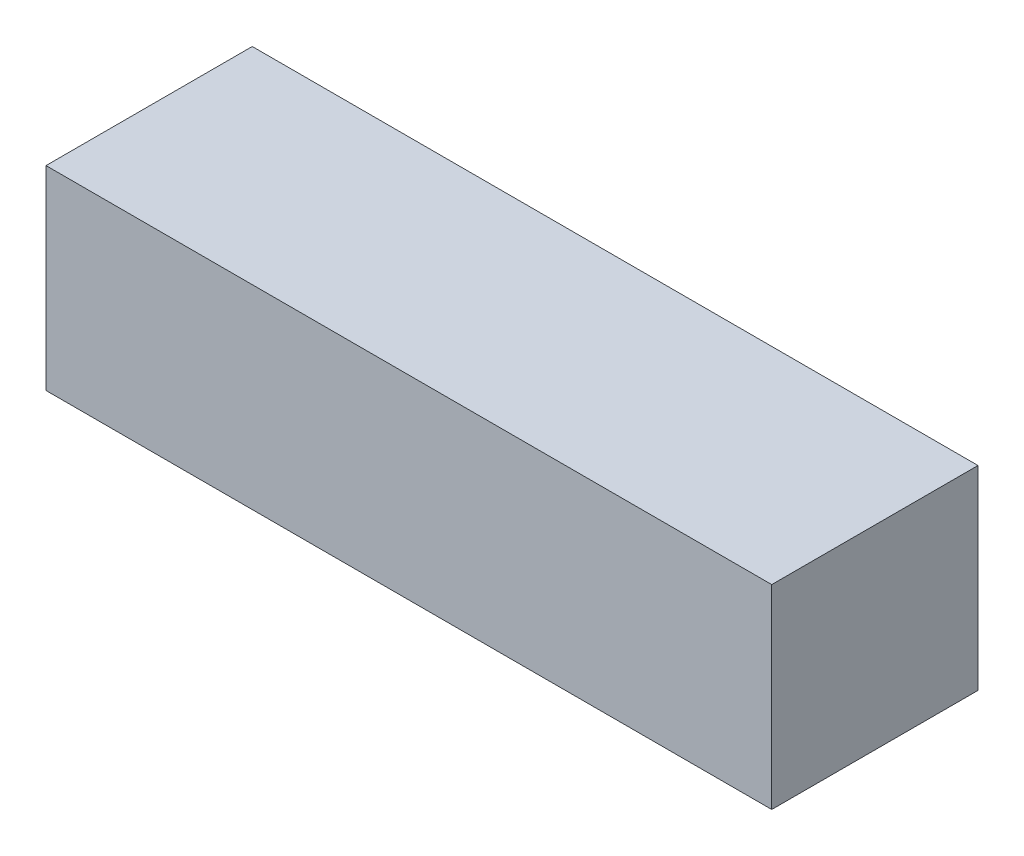
ISO-10303-21;
HEADER;
FILE_DESCRIPTION(('STEP AP214'),'2;1');
FILE_NAME('part.step','',(''),(''),'','','');
FILE_SCHEMA(('AUTOMOTIVE_DESIGN { 1 0 10303 214 1 1 1 1 }'));
ENDSEC;
DATA;
#1=APPLICATION_CONTEXT('core data for automotive mechanical design processes');
#2=APPLICATION_PROTOCOL_DEFINITION('international standard','automotive_design',2000,#1);
#3=PRODUCT_CONTEXT('',#1,'mechanical');
#4=PRODUCT('Part','Part','',(#3));
#5=PRODUCT_RELATED_PRODUCT_CATEGORY('part','',(#4));
#6=PRODUCT_DEFINITION_FORMATION('','',#4);
#7=PRODUCT_DEFINITION_CONTEXT('part definition',#1,'design');
#8=PRODUCT_DEFINITION('design','',#6,#7);
#9=PRODUCT_DEFINITION_SHAPE('','',#8);
#10=(LENGTH_UNIT() NAMED_UNIT(*) SI_UNIT(.MILLI.,.METRE.));
#11=(NAMED_UNIT(*) PLANE_ANGLE_UNIT() SI_UNIT($,.RADIAN.));
#12=(NAMED_UNIT(*) SI_UNIT($,.STERADIAN.) SOLID_ANGLE_UNIT());
#13=UNCERTAINTY_MEASURE_WITH_UNIT(LENGTH_MEASURE(1.E-05),#10,'distance_accuracy_value','');
#14=(GEOMETRIC_REPRESENTATION_CONTEXT(3) GLOBAL_UNCERTAINTY_ASSIGNED_CONTEXT((#13)) GLOBAL_UNIT_ASSIGNED_CONTEXT((#10,
#11,#12)) REPRESENTATION_CONTEXT('',''));
#15=CARTESIAN_POINT('',(0.,0.,0.));
#16=DIRECTION('',(0.,0.,1.));
#17=DIRECTION('',(1.,0.,0.));
#18=AXIS2_PLACEMENT_3D('',#15,#16,#17);
#19=CARTESIAN_POINT('',(9.5,5.1,2.7));
#20=DIRECTION('',(-1.,0.,0.));
#21=DIRECTION('',(0.,0.,1.));
#22=AXIS2_PLACEMENT_3D('',#19,#20,#21);
#23=PLANE('',#22);
#24=DIRECTION('',(0.,0.,-1.));
#25=VECTOR('',#24,1.);
#26=CARTESIAN_POINT('',(9.5,0.,2.7));
#27=LINE('',#26,#25);
#28=CARTESIAN_POINT('',(9.5,0.,2.7));
#29=VERTEX_POINT('',#28);
#30=CARTESIAN_POINT('',(9.5,0.,-2.7));
#31=VERTEX_POINT('',#30);
#32=EDGE_CURVE('E97',#29,#31,#27,.T.);
#33=ORIENTED_EDGE('',*,*,#32,.T.);
#34=DIRECTION('',(0.,-1.,0.));
#35=VECTOR('',#34,1.);
#36=CARTESIAN_POINT('',(9.5,5.1,-2.7));
#37=LINE('',#36,#35);
#38=CARTESIAN_POINT('',(9.5,5.1,-2.7));
#39=VERTEX_POINT('',#38);
#40=EDGE_CURVE('E11',#39,#31,#37,.T.);
#41=ORIENTED_EDGE('',*,*,#40,.F.);
#42=DIRECTION('',(0.,0.,-1.));
#43=VECTOR('',#42,1.);
#44=CARTESIAN_POINT('',(9.5,5.1,2.7));
#45=LINE('',#44,#43);
#46=CARTESIAN_POINT('',(9.5,5.1,2.7));
#47=VERTEX_POINT('',#46);
#48=EDGE_CURVE('E85',#47,#39,#45,.T.);
#49=ORIENTED_EDGE('',*,*,#48,.F.);
#50=DIRECTION('',(0.,-1.,0.));
#51=VECTOR('',#50,1.);
#52=CARTESIAN_POINT('',(9.5,5.1,2.7));
#53=LINE('',#52,#51);
#54=EDGE_CURVE('E93',#47,#29,#53,.T.);
#55=ORIENTED_EDGE('',*,*,#54,.T.);
#56=EDGE_LOOP('',(#33,#41,#49,#55));
#57=FACE_BOUND('',#56,.T.);
#58=ADVANCED_FACE('F34',(#57),#23,.F.);
#59=CARTESIAN_POINT('',(-9.5,5.1,-2.7));
#60=DIRECTION('',(0.,0.,1.));
#61=DIRECTION('',(1.,0.,0.));
#62=AXIS2_PLACEMENT_3D('',#59,#60,#61);
#63=PLANE('',#62);
#64=DIRECTION('',(-1.,0.,0.));
#65=VECTOR('',#64,1.);
#66=CARTESIAN_POINT('',(-9.5,0.,-2.7));
#67=LINE('',#66,#65);
#68=CARTESIAN_POINT('',(-9.5,0.,-2.7));
#69=VERTEX_POINT('',#68);
#70=EDGE_CURVE('E89',#31,#69,#67,.T.);
#71=ORIENTED_EDGE('',*,*,#70,.T.);
#72=DIRECTION('',(0.,-1.,0.));
#73=VECTOR('',#72,1.);
#74=CARTESIAN_POINT('',(-9.5,5.1,-2.7));
#75=LINE('',#74,#73);
#76=CARTESIAN_POINT('',(-9.5,5.1,-2.7));
#77=VERTEX_POINT('',#76);
#78=EDGE_CURVE('E42',#77,#69,#75,.T.);
#79=ORIENTED_EDGE('',*,*,#78,.F.);
#80=DIRECTION('',(-1.,0.,0.));
#81=VECTOR('',#80,1.);
#82=CARTESIAN_POINT('',(-9.5,5.1,-2.7));
#83=LINE('',#82,#81);
#84=EDGE_CURVE('E80',#39,#77,#83,.T.);
#85=ORIENTED_EDGE('',*,*,#84,.F.);
#86=ORIENTED_EDGE('',*,*,#40,.T.);
#87=EDGE_LOOP('',(#71,#79,#85,#86));
#88=FACE_BOUND('',#87,.T.);
#89=ADVANCED_FACE('F88',(#88),#63,.F.);
#90=CARTESIAN_POINT('',(-9.5,5.1,2.7));
#91=DIRECTION('',(1.,0.,0.));
#92=DIRECTION('',(0.,0.,-1.));
#93=AXIS2_PLACEMENT_3D('',#90,#91,#92);
#94=PLANE('',#93);
#95=DIRECTION('',(0.,0.,1.));
#96=VECTOR('',#95,1.);
#97=CARTESIAN_POINT('',(-9.5,0.,2.7));
#98=LINE('',#97,#96);
#99=CARTESIAN_POINT('',(-9.5,0.,2.7));
#100=VERTEX_POINT('',#99);
#101=EDGE_CURVE('E67',#69,#100,#98,.T.);
#102=ORIENTED_EDGE('',*,*,#101,.T.);
#103=DIRECTION('',(0.,-1.,0.));
#104=VECTOR('',#103,1.);
#105=CARTESIAN_POINT('',(-9.5,5.1,2.7));
#106=LINE('',#105,#104);
#107=CARTESIAN_POINT('',(-9.5,5.1,2.7));
#108=VERTEX_POINT('',#107);
#109=EDGE_CURVE('E90',#108,#100,#106,.T.);
#110=ORIENTED_EDGE('',*,*,#109,.F.);
#111=DIRECTION('',(0.,0.,1.));
#112=VECTOR('',#111,1.);
#113=CARTESIAN_POINT('',(-9.5,5.1,2.7));
#114=LINE('',#113,#112);
#115=EDGE_CURVE('E83',#77,#108,#114,.T.);
#116=ORIENTED_EDGE('',*,*,#115,.F.);
#117=ORIENTED_EDGE('',*,*,#78,.T.);
#118=EDGE_LOOP('',(#102,#110,#116,#117));
#119=FACE_BOUND('',#118,.T.);
#120=ADVANCED_FACE('F91',(#119),#94,.F.);
#121=CARTESIAN_POINT('',(-9.5,5.1,2.7));
#122=DIRECTION('',(0.,0.,-1.));
#123=DIRECTION('',(-1.,0.,0.));
#124=AXIS2_PLACEMENT_3D('',#121,#122,#123);
#125=PLANE('',#124);
#126=DIRECTION('',(1.,0.,0.));
#127=VECTOR('',#126,1.);
#128=CARTESIAN_POINT('',(-9.5,0.,2.7));
#129=LINE('',#128,#127);
#130=EDGE_CURVE('E73',#100,#29,#129,.T.);
#131=ORIENTED_EDGE('',*,*,#130,.T.);
#132=ORIENTED_EDGE('',*,*,#54,.F.);
#133=DIRECTION('',(1.,0.,0.));
#134=VECTOR('',#133,1.);
#135=CARTESIAN_POINT('',(-9.5,5.1,2.7));
#136=LINE('',#135,#134);
#137=EDGE_CURVE('E50',#108,#47,#136,.T.);
#138=ORIENTED_EDGE('',*,*,#137,.F.);
#139=ORIENTED_EDGE('',*,*,#109,.T.);
#140=EDGE_LOOP('',(#131,#132,#138,#139));
#141=FACE_BOUND('',#140,.T.);
#142=ADVANCED_FACE('F104',(#141),#125,.F.);
#143=CARTESIAN_POINT('',(0.,5.1,0.));
#144=DIRECTION('',(0.,-1.,0.));
#145=DIRECTION('',(0.,0.,-1.));
#146=AXIS2_PLACEMENT_3D('',#143,#144,#145);
#147=PLANE('',#146);
#148=ORIENTED_EDGE('',*,*,#48,.T.);
#149=ORIENTED_EDGE('',*,*,#84,.T.);
#150=ORIENTED_EDGE('',*,*,#115,.T.);
#151=ORIENTED_EDGE('',*,*,#137,.T.);
#152=EDGE_LOOP('',(#148,#149,#150,#151));
#153=FACE_BOUND('',#152,.T.);
#154=ADVANCED_FACE('F81',(#153),#147,.F.);
#155=CARTESIAN_POINT('',(0.,0.,0.));
#156=DIRECTION('',(0.,-1.,0.));
#157=DIRECTION('',(0.,0.,-1.));
#158=AXIS2_PLACEMENT_3D('',#155,#156,#157);
#159=PLANE('',#158);
#160=ORIENTED_EDGE('',*,*,#32,.F.);
#161=ORIENTED_EDGE('',*,*,#130,.F.);
#162=ORIENTED_EDGE('',*,*,#101,.F.);
#163=ORIENTED_EDGE('',*,*,#70,.F.);
#164=EDGE_LOOP('',(#160,#161,#162,#163));
#165=FACE_BOUND('',#164,.T.);
#166=ADVANCED_FACE('F107',(#165),#159,.T.);
#167=CLOSED_SHELL('',(#58,#89,#120,#142,#154,#166));
#168=MANIFOLD_SOLID_BREP('B2',#167);
#169=ADVANCED_BREP_SHAPE_REPRESENTATION('',(#18,#168),#14);
#170=SHAPE_DEFINITION_REPRESENTATION(#9,#169);
ENDSEC;
END-ISO-10303-21;
